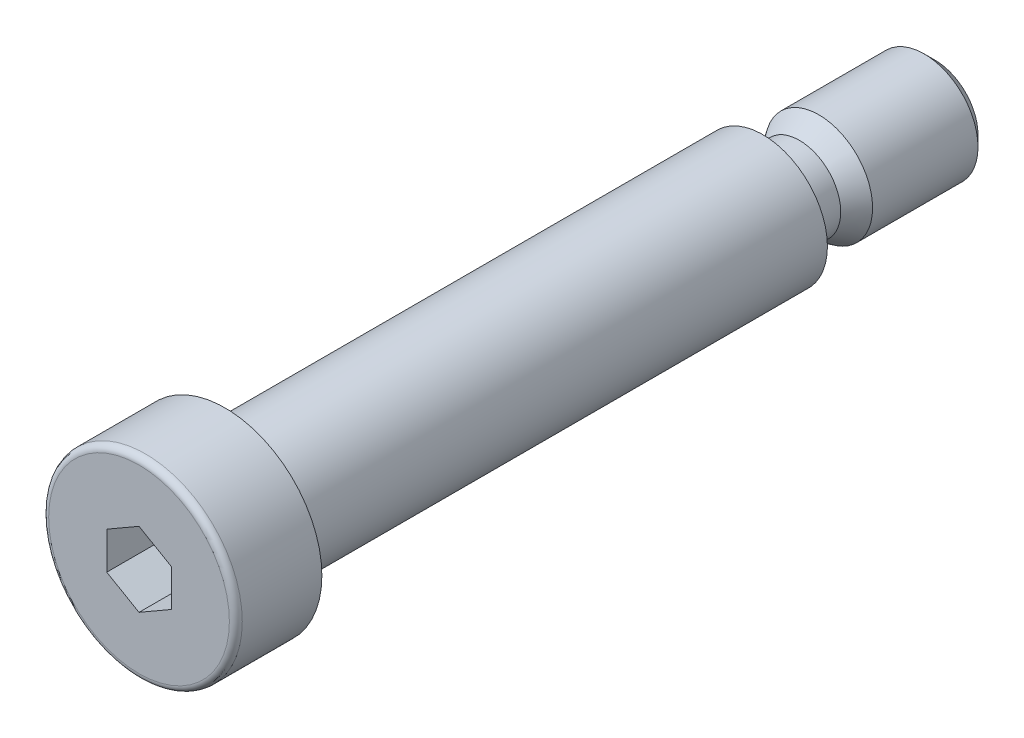
ISO-10303-21;
HEADER;
FILE_DESCRIPTION(('STEP AP214'),'2;1');
FILE_NAME('part.step','',(''),(''),'','','');
FILE_SCHEMA(('AUTOMOTIVE_DESIGN { 1 0 10303 214 1 1 1 1 }'));
ENDSEC;
DATA;
#1=APPLICATION_CONTEXT('core data for automotive mechanical design processes');
#2=APPLICATION_PROTOCOL_DEFINITION('international standard','automotive_design',2000,#1);
#3=PRODUCT_CONTEXT('',#1,'mechanical');
#4=PRODUCT('Part','Part','',(#3));
#5=PRODUCT_RELATED_PRODUCT_CATEGORY('part','',(#4));
#6=PRODUCT_DEFINITION_FORMATION('','',#4);
#7=PRODUCT_DEFINITION_CONTEXT('part definition',#1,'design');
#8=PRODUCT_DEFINITION('design','',#6,#7);
#9=PRODUCT_DEFINITION_SHAPE('','',#8);
#10=(LENGTH_UNIT() NAMED_UNIT(*) SI_UNIT(.MILLI.,.METRE.));
#11=(NAMED_UNIT(*) PLANE_ANGLE_UNIT() SI_UNIT($,.RADIAN.));
#12=(NAMED_UNIT(*) SI_UNIT($,.STERADIAN.) SOLID_ANGLE_UNIT());
#13=UNCERTAINTY_MEASURE_WITH_UNIT(LENGTH_MEASURE(1.E-05),#10,'distance_accuracy_value','');
#14=(GEOMETRIC_REPRESENTATION_CONTEXT(3) GLOBAL_UNCERTAINTY_ASSIGNED_CONTEXT((#13)) GLOBAL_UNIT_ASSIGNED_CONTEXT((#10,
#11,#12)) REPRESENTATION_CONTEXT('',''));
#15=CARTESIAN_POINT('',(0.,0.,0.));
#16=DIRECTION('',(0.,0.,1.));
#17=DIRECTION('',(1.,0.,0.));
#18=AXIS2_PLACEMENT_3D('',#15,#16,#17);
#19=CARTESIAN_POINT('',(0.,0.,33.));
#20=DIRECTION('',(0.,0.,1.));
#21=DIRECTION('',(1.,0.,0.));
#22=AXIS2_PLACEMENT_3D('',#19,#20,#21);
#23=PLANE('',#22);
#24=CARTESIAN_POINT('',(0.,0.,33.));
#25=DIRECTION('',(0.,0.,1.));
#26=DIRECTION('',(1.,0.,0.));
#27=AXIS2_PLACEMENT_3D('',#24,#25,#26);
#28=CIRCLE('',#27,8.4);
#29=CARTESIAN_POINT('',(8.4,0.,33.));
#30=VERTEX_POINT('',#29);
#31=EDGE_CURVE('E42',#30,#30,#28,.T.);
#32=ORIENTED_EDGE('',*,*,#31,.T.);
#33=EDGE_LOOP('',(#32));
#34=FACE_BOUND('',#33,.T.);
#35=DIRECTION('',(0.,1.,0.));
#36=VECTOR('',#35,1.);
#37=CARTESIAN_POINT('',(3.,-1.73205080756888,33.));
#38=LINE('',#37,#36);
#39=CARTESIAN_POINT('',(3.,-1.73205080756888,33.));
#40=VERTEX_POINT('',#39);
#41=CARTESIAN_POINT('',(3.,1.73205080756888,33.));
#42=VERTEX_POINT('',#41);
#43=EDGE_CURVE('E49',#40,#42,#38,.T.);
#44=ORIENTED_EDGE('',*,*,#43,.F.);
#45=DIRECTION('',(0.866025403784439,0.5,0.));
#46=VECTOR('',#45,1.);
#47=CARTESIAN_POINT('',(0.,-3.46410161513775,33.));
#48=LINE('',#47,#46);
#49=CARTESIAN_POINT('',(0.,-3.46410161513775,33.));
#50=VERTEX_POINT('',#49);
#51=EDGE_CURVE('E132',#50,#40,#48,.T.);
#52=ORIENTED_EDGE('',*,*,#51,.F.);
#53=DIRECTION('',(0.866025403784439,-0.5,0.));
#54=VECTOR('',#53,1.);
#55=CARTESIAN_POINT('',(-3.,-1.73205080756888,33.));
#56=LINE('',#55,#54);
#57=CARTESIAN_POINT('',(-3.,-1.73205080756888,33.));
#58=VERTEX_POINT('',#57);
#59=EDGE_CURVE('E130',#58,#50,#56,.T.);
#60=ORIENTED_EDGE('',*,*,#59,.F.);
#61=DIRECTION('',(0.,-1.,0.));
#62=VECTOR('',#61,1.);
#63=CARTESIAN_POINT('',(-3.,1.73205080756888,33.));
#64=LINE('',#63,#62);
#65=CARTESIAN_POINT('',(-3.,1.73205080756888,33.));
#66=VERTEX_POINT('',#65);
#67=EDGE_CURVE('E97',#66,#58,#64,.T.);
#68=ORIENTED_EDGE('',*,*,#67,.F.);
#69=DIRECTION('',(-0.866025403784439,-0.5,0.));
#70=VECTOR('',#69,1.);
#71=CARTESIAN_POINT('',(0.,3.46410161513775,33.));
#72=LINE('',#71,#70);
#73=CARTESIAN_POINT('',(0.,3.46410161513775,33.));
#74=VERTEX_POINT('',#73);
#75=EDGE_CURVE('E126',#74,#66,#72,.T.);
#76=ORIENTED_EDGE('',*,*,#75,.F.);
#77=DIRECTION('',(-0.866025403784439,0.5,0.));
#78=VECTOR('',#77,1.);
#79=CARTESIAN_POINT('',(3.,1.73205080756888,33.));
#80=LINE('',#79,#78);
#81=EDGE_CURVE('E123',#42,#74,#80,.T.);
#82=ORIENTED_EDGE('',*,*,#81,.F.);
#83=EDGE_LOOP('',(#44,#52,#60,#68,#76,#82));
#84=FACE_BOUND('',#83,.T.);
#85=ADVANCED_FACE('F34',(#34,#84),#23,.T.);
#86=CARTESIAN_POINT('',(0.,0.,-41.));
#87=DIRECTION('',(0.,0.,1.));
#88=DIRECTION('',(1.,0.,0.));
#89=AXIS2_PLACEMENT_3D('',#86,#87,#88);
#90=PLANE('',#89);
#91=CARTESIAN_POINT('',(0.,0.,-41.));
#92=DIRECTION('',(0.,0.,1.));
#93=DIRECTION('',(1.,0.,0.));
#94=AXIS2_PLACEMENT_3D('',#91,#92,#93);
#95=CIRCLE('',#94,4.);
#96=CARTESIAN_POINT('',(4.,0.,-41.));
#97=VERTEX_POINT('',#96);
#98=EDGE_CURVE('E162',#97,#97,#95,.T.);
#99=ORIENTED_EDGE('',*,*,#98,.F.);
#100=EDGE_LOOP('',(#99));
#101=FACE_BOUND('',#100,.T.);
#102=ADVANCED_FACE('F178',(#101),#90,.F.);
#103=CARTESIAN_POINT('',(0.,0.,-41.));
#104=DIRECTION('',(0.,0.,1.));
#105=DIRECTION('',(1.,0.,0.));
#106=AXIS2_PLACEMENT_3D('',#103,#104,#105);
#107=CONICAL_SURFACE('',#106,4.,0.785398163397447);
#108=CARTESIAN_POINT('',(0.,0.,-40.));
#109=DIRECTION('',(0.,0.,1.));
#110=DIRECTION('',(1.,0.,0.));
#111=AXIS2_PLACEMENT_3D('',#108,#109,#110);
#112=CIRCLE('',#111,5.);
#113=CARTESIAN_POINT('',(5.,0.,-40.));
#114=VERTEX_POINT('',#113);
#115=EDGE_CURVE('E159',#114,#114,#112,.T.);
#116=ORIENTED_EDGE('',*,*,#115,.F.);
#117=EDGE_LOOP('',(#116));
#118=FACE_BOUND('',#117,.T.);
#119=ORIENTED_EDGE('',*,*,#98,.T.);
#120=EDGE_LOOP('',(#119));
#121=FACE_BOUND('',#120,.T.);
#122=ADVANCED_FACE('F182',(#118,#121),#107,.T.);
#123=CARTESIAN_POINT('',(0.,0.,33.));
#124=DIRECTION('',(0.,0.,1.));
#125=DIRECTION('',(1.,0.,0.));
#126=AXIS2_PLACEMENT_3D('',#123,#124,#125);
#127=CYLINDRICAL_SURFACE('',#126,5.);
#128=CARTESIAN_POINT('',(0.,0.,-30.2));
#129=DIRECTION('',(0.,0.,1.));
#130=DIRECTION('',(1.,0.,0.));
#131=AXIS2_PLACEMENT_3D('',#128,#129,#130);
#132=CIRCLE('',#131,5.);
#133=CARTESIAN_POINT('',(5.,0.,-30.2));
#134=VERTEX_POINT('',#133);
#135=EDGE_CURVE('E156',#134,#134,#132,.T.);
#136=ORIENTED_EDGE('',*,*,#135,.F.);
#137=EDGE_LOOP('',(#136));
#138=FACE_BOUND('',#137,.T.);
#139=ORIENTED_EDGE('',*,*,#115,.T.);
#140=EDGE_LOOP('',(#139));
#141=FACE_BOUND('',#140,.T.);
#142=ADVANCED_FACE('F188',(#138,#141),#127,.T.);
#143=CARTESIAN_POINT('',(0.,0.,-30.2));
#144=DIRECTION('',(0.,0.,-1.));
#145=DIRECTION('',(-1.,0.,0.));
#146=AXIS2_PLACEMENT_3D('',#143,#144,#145);
#147=CONICAL_SURFACE('',#146,5.,0.566013910063239);
#148=CARTESIAN_POINT('',(0.,0.,-28.39));
#149=DIRECTION('',(0.,0.,1.));
#150=DIRECTION('',(1.,0.,0.));
#151=AXIS2_PLACEMENT_3D('',#148,#149,#150);
#152=CIRCLE('',#151,3.85000000000001);
#153=CARTESIAN_POINT('',(3.85000000000001,0.,-28.39));
#154=VERTEX_POINT('',#153);
#155=EDGE_CURVE('E153',#154,#154,#152,.T.);
#156=ORIENTED_EDGE('',*,*,#155,.F.);
#157=EDGE_LOOP('',(#156));
#158=FACE_BOUND('',#157,.T.);
#159=ORIENTED_EDGE('',*,*,#135,.T.);
#160=EDGE_LOOP('',(#159));
#161=FACE_BOUND('',#160,.T.);
#162=ADVANCED_FACE('F192',(#158,#161),#147,.T.);
#163=CARTESIAN_POINT('',(0.,0.,33.));
#164=DIRECTION('',(0.,0.,1.));
#165=DIRECTION('',(1.,0.,0.));
#166=AXIS2_PLACEMENT_3D('',#163,#164,#165);
#167=CYLINDRICAL_SURFACE('',#166,3.85000000000001);
#168=ORIENTED_EDGE('',*,*,#155,.T.);
#169=EDGE_LOOP('',(#168));
#170=FACE_BOUND('',#169,.T.);
#171=CARTESIAN_POINT('',(0.,0.,-25.));
#172=DIRECTION('',(0.,0.,1.));
#173=DIRECTION('',(1.,0.,0.));
#174=AXIS2_PLACEMENT_3D('',#171,#172,#173);
#175=CIRCLE('',#174,3.85000000000001);
#176=CARTESIAN_POINT('',(3.85000000000001,0.,-25.));
#177=VERTEX_POINT('',#176);
#178=EDGE_CURVE('E150',#177,#177,#175,.T.);
#179=ORIENTED_EDGE('',*,*,#178,.F.);
#180=EDGE_LOOP('',(#179));
#181=FACE_BOUND('',#180,.T.);
#182=ADVANCED_FACE('F196',(#170,#181),#167,.T.);
#183=CARTESIAN_POINT('',(0.,0.,-25.));
#184=DIRECTION('',(0.,0.,1.));
#185=DIRECTION('',(1.,0.,0.));
#186=AXIS2_PLACEMENT_3D('',#183,#184,#185);
#187=PLANE('',#186);
#188=CARTESIAN_POINT('',(0.,0.,-25.));
#189=DIRECTION('',(0.,0.,1.));
#190=DIRECTION('',(1.,0.,0.));
#191=AXIS2_PLACEMENT_3D('',#188,#189,#190);
#192=CIRCLE('',#191,6.);
#193=CARTESIAN_POINT('',(6.,0.,-25.));
#194=VERTEX_POINT('',#193);
#195=EDGE_CURVE('E147',#194,#194,#192,.T.);
#196=ORIENTED_EDGE('',*,*,#195,.F.);
#197=EDGE_LOOP('',(#196));
#198=FACE_BOUND('',#197,.T.);
#199=ORIENTED_EDGE('',*,*,#178,.T.);
#200=EDGE_LOOP('',(#199));
#201=FACE_BOUND('',#200,.T.);
#202=ADVANCED_FACE('F200',(#198,#201),#187,.F.);
#203=CARTESIAN_POINT('',(0.,0.,33.));
#204=DIRECTION('',(0.,0.,1.));
#205=DIRECTION('',(1.,0.,0.));
#206=AXIS2_PLACEMENT_3D('',#203,#204,#205);
#207=CYLINDRICAL_SURFACE('',#206,6.);
#208=ORIENTED_EDGE('',*,*,#195,.T.);
#209=EDGE_LOOP('',(#208));
#210=FACE_BOUND('',#209,.T.);
#211=CARTESIAN_POINT('',(0.,0.,25.));
#212=DIRECTION('',(0.,0.,1.));
#213=DIRECTION('',(1.,0.,0.));
#214=AXIS2_PLACEMENT_3D('',#211,#212,#213);
#215=CIRCLE('',#214,6.);
#216=CARTESIAN_POINT('',(6.,0.,25.));
#217=VERTEX_POINT('',#216);
#218=EDGE_CURVE('E144',#217,#217,#215,.T.);
#219=ORIENTED_EDGE('',*,*,#218,.F.);
#220=EDGE_LOOP('',(#219));
#221=FACE_BOUND('',#220,.T.);
#222=ADVANCED_FACE('F204',(#210,#221),#207,.T.);
#223=CARTESIAN_POINT('',(0.,0.,25.));
#224=DIRECTION('',(0.,0.,1.));
#225=DIRECTION('',(1.,0.,0.));
#226=AXIS2_PLACEMENT_3D('',#223,#224,#225);
#227=PLANE('',#226);
#228=CARTESIAN_POINT('',(0.,0.,25.));
#229=DIRECTION('',(0.,0.,1.));
#230=DIRECTION('',(1.,0.,0.));
#231=AXIS2_PLACEMENT_3D('',#228,#229,#230);
#232=CIRCLE('',#231,9.);
#233=CARTESIAN_POINT('',(9.,0.,25.));
#234=VERTEX_POINT('',#233);
#235=EDGE_CURVE('E136',#234,#234,#232,.T.);
#236=ORIENTED_EDGE('',*,*,#235,.F.);
#237=EDGE_LOOP('',(#236));
#238=FACE_BOUND('',#237,.T.);
#239=ORIENTED_EDGE('',*,*,#218,.T.);
#240=EDGE_LOOP('',(#239));
#241=FACE_BOUND('',#240,.T.);
#242=ADVANCED_FACE('F208',(#238,#241),#227,.F.);
#243=CARTESIAN_POINT('',(0.,0.,33.));
#244=DIRECTION('',(0.,0.,1.));
#245=DIRECTION('',(1.,0.,0.));
#246=AXIS2_PLACEMENT_3D('',#243,#244,#245);
#247=CYLINDRICAL_SURFACE('',#246,9.);
#248=CARTESIAN_POINT('',(0.,0.,32.4));
#249=DIRECTION('',(0.,0.,1.));
#250=DIRECTION('',(1.,0.,0.));
#251=AXIS2_PLACEMENT_3D('',#248,#249,#250);
#252=CIRCLE('',#251,9.);
#253=CARTESIAN_POINT('',(9.,0.,32.4));
#254=VERTEX_POINT('',#253);
#255=EDGE_CURVE('E11',#254,#254,#252,.F.);
#256=ORIENTED_EDGE('',*,*,#255,.T.);
#257=EDGE_LOOP('',(#256));
#258=FACE_BOUND('',#257,.T.);
#259=ORIENTED_EDGE('',*,*,#235,.T.);
#260=EDGE_LOOP('',(#259));
#261=FACE_BOUND('',#260,.T.);
#262=ADVANCED_FACE('F212',(#258,#261),#247,.T.);
#263=CARTESIAN_POINT('',(3.,-1.73205080756888,28.1));
#264=DIRECTION('',(1.,0.,0.));
#265=DIRECTION('',(0.,1.,0.));
#266=AXIS2_PLACEMENT_3D('',#263,#264,#265);
#267=PLANE('',#266);
#268=ORIENTED_EDGE('',*,*,#43,.T.);
#269=DIRECTION('',(0.,0.,1.));
#270=VECTOR('',#269,1.);
#271=CARTESIAN_POINT('',(3.,1.73205080756888,28.1));
#272=LINE('',#271,#270);
#273=CARTESIAN_POINT('',(3.,1.73205080756888,28.1));
#274=VERTEX_POINT('',#273);
#275=EDGE_CURVE('E79',#274,#42,#272,.T.);
#276=ORIENTED_EDGE('',*,*,#275,.F.);
#277=DIRECTION('',(0.,1.,0.));
#278=VECTOR('',#277,1.);
#279=CARTESIAN_POINT('',(3.,-1.73205080756888,28.1));
#280=LINE('',#279,#278);
#281=CARTESIAN_POINT('',(3.,-1.73205080756888,28.1));
#282=VERTEX_POINT('',#281);
#283=EDGE_CURVE('E134',#282,#274,#280,.T.);
#284=ORIENTED_EDGE('',*,*,#283,.F.);
#285=DIRECTION('',(0.,0.,1.));
#286=VECTOR('',#285,1.);
#287=CARTESIAN_POINT('',(3.,-1.73205080756888,28.1));
#288=LINE('',#287,#286);
#289=EDGE_CURVE('E57',#282,#40,#288,.T.);
#290=ORIENTED_EDGE('',*,*,#289,.T.);
#291=EDGE_LOOP('',(#268,#276,#284,#290));
#292=FACE_BOUND('',#291,.T.);
#293=ADVANCED_FACE('F216',(#292),#267,.F.);
#294=CARTESIAN_POINT('',(0.,-3.46410161513775,28.1));
#295=DIRECTION('',(0.5,-0.866025403784439,0.));
#296=DIRECTION('',(0.866025403784439,0.5,0.));
#297=AXIS2_PLACEMENT_3D('',#294,#295,#296);
#298=PLANE('',#297);
#299=ORIENTED_EDGE('',*,*,#51,.T.);
#300=ORIENTED_EDGE('',*,*,#289,.F.);
#301=DIRECTION('',(0.866025403784439,0.5,0.));
#302=VECTOR('',#301,1.);
#303=CARTESIAN_POINT('',(0.,-3.46410161513775,28.1));
#304=LINE('',#303,#302);
#305=CARTESIAN_POINT('',(0.,-3.46410161513775,28.1));
#306=VERTEX_POINT('',#305);
#307=EDGE_CURVE('E109',#306,#282,#304,.T.);
#308=ORIENTED_EDGE('',*,*,#307,.F.);
#309=DIRECTION('',(0.,0.,1.));
#310=VECTOR('',#309,1.);
#311=CARTESIAN_POINT('',(0.,-3.46410161513775,28.1));
#312=LINE('',#311,#310);
#313=EDGE_CURVE('E101',#306,#50,#312,.T.);
#314=ORIENTED_EDGE('',*,*,#313,.T.);
#315=EDGE_LOOP('',(#299,#300,#308,#314));
#316=FACE_BOUND('',#315,.T.);
#317=ADVANCED_FACE('F220',(#316),#298,.F.);
#318=CARTESIAN_POINT('',(-3.,-1.73205080756888,28.1));
#319=DIRECTION('',(-0.5,-0.866025403784439,0.));
#320=DIRECTION('',(0.866025403784439,-0.5,0.));
#321=AXIS2_PLACEMENT_3D('',#318,#319,#320);
#322=PLANE('',#321);
#323=ORIENTED_EDGE('',*,*,#59,.T.);
#324=ORIENTED_EDGE('',*,*,#313,.F.);
#325=DIRECTION('',(0.866025403784439,-0.5,0.));
#326=VECTOR('',#325,1.);
#327=CARTESIAN_POINT('',(-3.,-1.73205080756888,28.1));
#328=LINE('',#327,#326);
#329=CARTESIAN_POINT('',(-3.,-1.73205080756888,28.1));
#330=VERTEX_POINT('',#329);
#331=EDGE_CURVE('E105',#330,#306,#328,.T.);
#332=ORIENTED_EDGE('',*,*,#331,.F.);
#333=DIRECTION('',(0.,0.,1.));
#334=VECTOR('',#333,1.);
#335=CARTESIAN_POINT('',(-3.,-1.73205080756888,28.1));
#336=LINE('',#335,#334);
#337=EDGE_CURVE('E90',#330,#58,#336,.T.);
#338=ORIENTED_EDGE('',*,*,#337,.T.);
#339=EDGE_LOOP('',(#323,#324,#332,#338));
#340=FACE_BOUND('',#339,.T.);
#341=ADVANCED_FACE('F106',(#340),#322,.F.);
#342=CARTESIAN_POINT('',(-3.,1.73205080756888,28.1));
#343=DIRECTION('',(-1.,0.,0.));
#344=DIRECTION('',(0.,0.,1.));
#345=AXIS2_PLACEMENT_3D('',#342,#343,#344);
#346=PLANE('',#345);
#347=ORIENTED_EDGE('',*,*,#67,.T.);
#348=ORIENTED_EDGE('',*,*,#337,.F.);
#349=DIRECTION('',(0.,-1.,0.));
#350=VECTOR('',#349,1.);
#351=CARTESIAN_POINT('',(-3.,1.73205080756888,28.1));
#352=LINE('',#351,#350);
#353=CARTESIAN_POINT('',(-3.,1.73205080756888,28.1));
#354=VERTEX_POINT('',#353);
#355=EDGE_CURVE('E94',#354,#330,#352,.T.);
#356=ORIENTED_EDGE('',*,*,#355,.F.);
#357=DIRECTION('',(0.,0.,1.));
#358=VECTOR('',#357,1.);
#359=CARTESIAN_POINT('',(-3.,1.73205080756888,28.1));
#360=LINE('',#359,#358);
#361=EDGE_CURVE('E102',#354,#66,#360,.T.);
#362=ORIENTED_EDGE('',*,*,#361,.T.);
#363=EDGE_LOOP('',(#347,#348,#356,#362));
#364=FACE_BOUND('',#363,.T.);
#365=ADVANCED_FACE('F92',(#364),#346,.F.);
#366=CARTESIAN_POINT('',(0.,3.46410161513775,28.1));
#367=DIRECTION('',(-0.5,0.866025403784439,0.));
#368=DIRECTION('',(-0.866025403784439,-0.5,0.));
#369=AXIS2_PLACEMENT_3D('',#366,#367,#368);
#370=PLANE('',#369);
#371=ORIENTED_EDGE('',*,*,#75,.T.);
#372=ORIENTED_EDGE('',*,*,#361,.F.);
#373=DIRECTION('',(-0.866025403784439,-0.5,0.));
#374=VECTOR('',#373,1.);
#375=CARTESIAN_POINT('',(0.,3.46410161513775,28.1));
#376=LINE('',#375,#374);
#377=CARTESIAN_POINT('',(0.,3.46410161513775,28.1));
#378=VERTEX_POINT('',#377);
#379=EDGE_CURVE('E115',#378,#354,#376,.T.);
#380=ORIENTED_EDGE('',*,*,#379,.F.);
#381=DIRECTION('',(0.,0.,1.));
#382=VECTOR('',#381,1.);
#383=CARTESIAN_POINT('',(0.,3.46410161513775,28.1));
#384=LINE('',#383,#382);
#385=EDGE_CURVE('E139',#378,#74,#384,.T.);
#386=ORIENTED_EDGE('',*,*,#385,.T.);
#387=EDGE_LOOP('',(#371,#372,#380,#386));
#388=FACE_BOUND('',#387,.T.);
#389=ADVANCED_FACE('F223',(#388),#370,.F.);
#390=CARTESIAN_POINT('',(3.,1.73205080756888,28.1));
#391=DIRECTION('',(0.5,0.866025403784439,0.));
#392=DIRECTION('',(-0.866025403784439,0.5,0.));
#393=AXIS2_PLACEMENT_3D('',#390,#391,#392);
#394=PLANE('',#393);
#395=ORIENTED_EDGE('',*,*,#81,.T.);
#396=ORIENTED_EDGE('',*,*,#385,.F.);
#397=DIRECTION('',(-0.866025403784439,0.5,0.));
#398=VECTOR('',#397,1.);
#399=CARTESIAN_POINT('',(3.,1.73205080756888,28.1));
#400=LINE('',#399,#398);
#401=EDGE_CURVE('E117',#274,#378,#400,.T.);
#402=ORIENTED_EDGE('',*,*,#401,.F.);
#403=ORIENTED_EDGE('',*,*,#275,.T.);
#404=EDGE_LOOP('',(#395,#396,#402,#403));
#405=FACE_BOUND('',#404,.T.);
#406=ADVANCED_FACE('F174',(#405),#394,.F.);
#407=CARTESIAN_POINT('',(0.,0.,28.1));
#408=DIRECTION('',(0.,0.,1.));
#409=DIRECTION('',(1.,0.,0.));
#410=AXIS2_PLACEMENT_3D('',#407,#408,#409);
#411=PLANE('',#410);
#412=ORIENTED_EDGE('',*,*,#283,.T.);
#413=ORIENTED_EDGE('',*,*,#401,.T.);
#414=ORIENTED_EDGE('',*,*,#379,.T.);
#415=ORIENTED_EDGE('',*,*,#355,.T.);
#416=ORIENTED_EDGE('',*,*,#331,.T.);
#417=ORIENTED_EDGE('',*,*,#307,.T.);
#418=EDGE_LOOP('',(#412,#413,#414,#415,#416,#417));
#419=FACE_BOUND('',#418,.T.);
#420=ADVANCED_FACE('F112',(#419),#411,.T.);
#421=CARTESIAN_POINT('',(0.,0.,32.4));
#422=DIRECTION('',(0.,0.,1.));
#423=DIRECTION('',(1.,0.,0.));
#424=AXIS2_PLACEMENT_3D('',#421,#422,#423);
#425=TOROIDAL_SURFACE('',#424,8.4,0.6);
#426=ORIENTED_EDGE('',*,*,#255,.F.);
#427=EDGE_LOOP('',(#426));
#428=FACE_BOUND('',#427,.T.);
#429=ORIENTED_EDGE('',*,*,#31,.F.);
#430=EDGE_LOOP('',(#429));
#431=FACE_BOUND('',#430,.T.);
#432=ADVANCED_FACE('F36',(#428,#431),#425,.T.);
#433=CLOSED_SHELL('',(#85,#102,#122,#142,#162,#182,#202,#222,#242,#262,#293,#317,#341,#365,#389,
#406,#420,#432));
#434=MANIFOLD_SOLID_BREP('B2',#433);
#435=ADVANCED_BREP_SHAPE_REPRESENTATION('',(#18,#434),#14);
#436=SHAPE_DEFINITION_REPRESENTATION(#9,#435);
ENDSEC;
END-ISO-10303-21;
